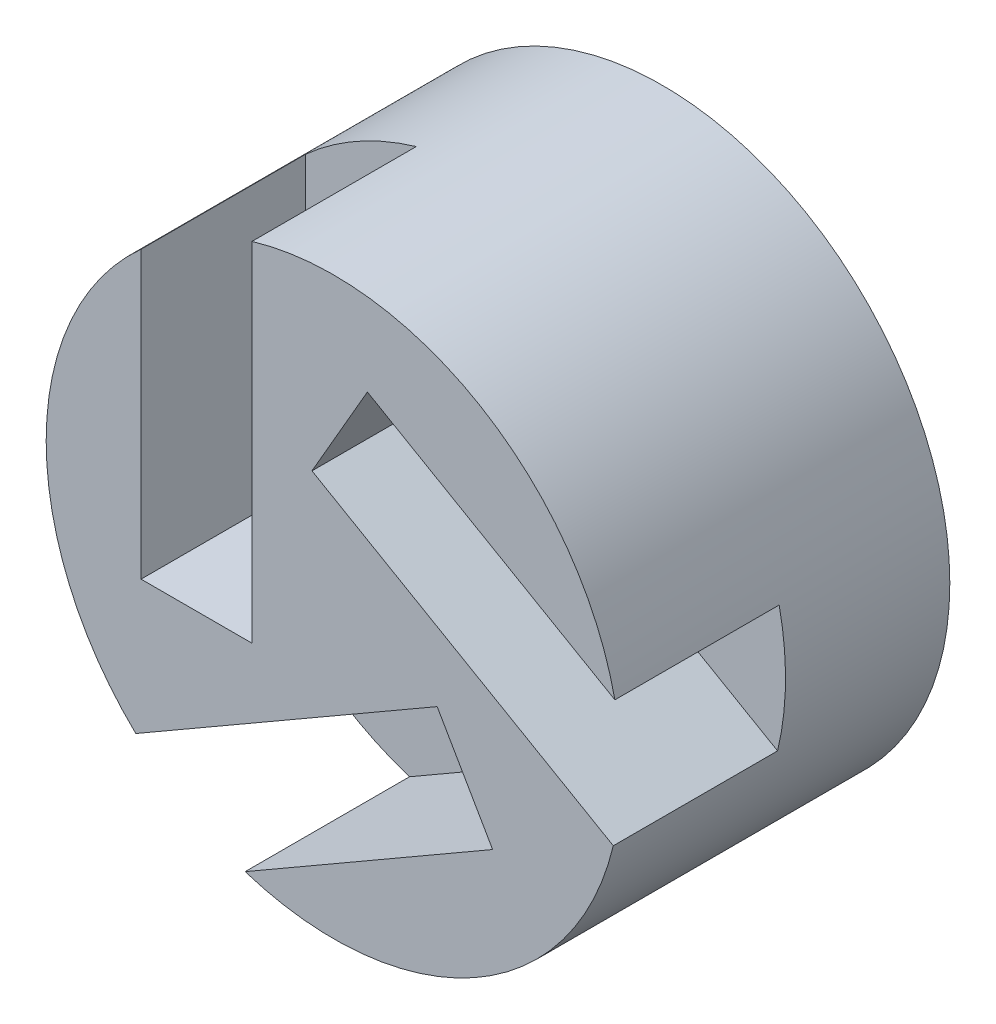
ISO-10303-21;
HEADER;
FILE_DESCRIPTION(('STEP AP214'),'2;1');
FILE_NAME('part.step','',(''),(''),'','','');
FILE_SCHEMA(('AUTOMOTIVE_DESIGN { 1 0 10303 214 1 1 1 1 }'));
ENDSEC;
DATA;
#1=APPLICATION_CONTEXT('core data for automotive mechanical design processes');
#2=APPLICATION_PROTOCOL_DEFINITION('international standard','automotive_design',2000,#1);
#3=PRODUCT_CONTEXT('',#1,'mechanical');
#4=PRODUCT('Part','Part','',(#3));
#5=PRODUCT_RELATED_PRODUCT_CATEGORY('part','',(#4));
#6=PRODUCT_DEFINITION_FORMATION('','',#4);
#7=PRODUCT_DEFINITION_CONTEXT('part definition',#1,'design');
#8=PRODUCT_DEFINITION('design','',#6,#7);
#9=PRODUCT_DEFINITION_SHAPE('','',#8);
#10=(LENGTH_UNIT() NAMED_UNIT(*) SI_UNIT(.MILLI.,.METRE.));
#11=(NAMED_UNIT(*) PLANE_ANGLE_UNIT() SI_UNIT($,.RADIAN.));
#12=(NAMED_UNIT(*) SI_UNIT($,.STERADIAN.) SOLID_ANGLE_UNIT());
#13=UNCERTAINTY_MEASURE_WITH_UNIT(LENGTH_MEASURE(1.E-05),#10,'distance_accuracy_value','');
#14=(GEOMETRIC_REPRESENTATION_CONTEXT(3) GLOBAL_UNCERTAINTY_ASSIGNED_CONTEXT((#13)) GLOBAL_UNIT_ASSIGNED_CONTEXT((#10,
#11,#12)) REPRESENTATION_CONTEXT('',''));
#15=CARTESIAN_POINT('',(0.,0.,0.));
#16=DIRECTION('',(0.,0.,1.));
#17=DIRECTION('',(1.,0.,0.));
#18=AXIS2_PLACEMENT_3D('',#15,#16,#17);
#19=CARTESIAN_POINT('',(0.,0.,0.));
#20=DIRECTION('',(0.,0.,-1.));
#21=DIRECTION('',(-1.,0.,0.));
#22=AXIS2_PLACEMENT_3D('',#19,#20,#21);
#23=PLANE('',#22);
#24=CARTESIAN_POINT('',(7.46538653438088,5.33042877568823,0.));
#25=DIRECTION('',(0.,0.,1.));
#26=DIRECTION('',(1.,0.,0.));
#27=AXIS2_PLACEMENT_3D('',#24,#25,#26);
#28=CIRCLE('',#27,1.625);
#29=CARTESIAN_POINT('',(9.09038653438088,5.33042877568823,0.));
#30=VERTEX_POINT('',#29);
#31=EDGE_CURVE('E300',#30,#30,#28,.T.);
#32=ORIENTED_EDGE('',*,*,#31,.F.);
#33=EDGE_LOOP('',(#32));
#34=FACE_BOUND('',#33,.T.);
#35=DIRECTION('',(-0.866025403784439,0.5,0.));
#36=VECTOR('',#35,1.);
#37=CARTESIAN_POINT('',(5.86199000000002,10.1532645134607,0.));
#38=LINE('',#37,#36);
#39=CARTESIAN_POINT('',(17.1135996501656,3.65714465312103,0.));
#40=VERTEX_POINT('',#39);
#41=CARTESIAN_POINT('',(2.05147822334851,12.3532645134607,0.));
#42=VERTEX_POINT('',#41);
#43=EDGE_CURVE('E166',#40,#42,#38,.T.);
#44=ORIENTED_EDGE('',*,*,#43,.T.);
#45=DIRECTION('',(-0.5,-0.866025403784439,0.));
#46=VECTOR('',#45,1.);
#47=CARTESIAN_POINT('',(-3.81051177665152,2.19999999999999,0.));
#48=LINE('',#47,#46);
#49=CARTESIAN_POINT('',(-1.32352177665146,6.50759303791581,0.));
#50=VERTEX_POINT('',#49);
#51=EDGE_CURVE('E175',#42,#50,#48,.T.);
#52=ORIENTED_EDGE('',*,*,#51,.T.);
#53=DIRECTION('',(0.866025403784439,-0.5,0.));
#54=VECTOR('',#53,1.);
#55=CARTESIAN_POINT('',(2.48699000000006,4.30759303791582,0.));
#56=LINE('',#55,#54);
#57=CARTESIAN_POINT('',(17.0173768571935,-4.0815297255142,0.));
#58=VERTEX_POINT('',#57);
#59=EDGE_CURVE('E350',#50,#58,#56,.T.);
#60=ORIENTED_EDGE('',*,*,#59,.T.);
#61=CARTESIAN_POINT('',(0.,0.,0.));
#62=DIRECTION('',(0.,0.,-1.));
#63=DIRECTION('',(-1.,0.,0.));
#64=AXIS2_PLACEMENT_3D('',#61,#62,#63);
#65=CIRCLE('',#64,17.5);
#66=EDGE_CURVE('E281',#40,#58,#65,.T.);
#67=ORIENTED_EDGE('',*,*,#66,.F.);
#68=EDGE_LOOP('',(#44,#52,#60,#67));
#69=FACE_BOUND('',#68,.T.);
#70=ADVANCED_FACE('F149',(#34,#69),#23,.F.);
#71=CARTESIAN_POINT('',(0.,0.,10.));
#72=DIRECTION('',(0.,0.,-1.));
#73=DIRECTION('',(-1.,0.,0.));
#74=AXIS2_PLACEMENT_3D('',#71,#72,#73);
#75=CYLINDRICAL_SURFACE('',#74,17.5);
#76=CARTESIAN_POINT('',(0.,0.,10.));
#77=DIRECTION('',(0.,0.,1.));
#78=DIRECTION('',(1.,0.,0.));
#79=AXIS2_PLACEMENT_3D('',#76,#77,#78);
#80=CIRCLE('',#79,17.5);
#81=CARTESIAN_POINT('',(-5.38961965016557,-16.6493843738004,10.));
#82=VERTEX_POINT('',#81);
#83=CARTESIAN_POINT('',(17.0173768571935,-4.0815297255142,10.));
#84=VERTEX_POINT('',#83);
#85=EDGE_CURVE('E12',#82,#84,#80,.T.);
#86=ORIENTED_EDGE('',*,*,#85,.F.);
#87=DIRECTION('',(0.,0.,1.));
#88=VECTOR('',#87,1.);
#89=CARTESIAN_POINT('',(-5.38961965016557,-16.6493843738004,0.));
#90=LINE('',#89,#88);
#91=CARTESIAN_POINT('',(-5.38961965016557,-16.6493843738004,0.));
#92=VERTEX_POINT('',#91);
#93=EDGE_CURVE('E362',#92,#82,#90,.T.);
#94=ORIENTED_EDGE('',*,*,#93,.F.);
#95=CARTESIAN_POINT('',(-12.0433968571934,-12.6967158013458,0.));
#96=VERTEX_POINT('',#95);
#97=EDGE_CURVE('E282',#92,#96,#65,.T.);
#98=ORIENTED_EDGE('',*,*,#97,.T.);
#99=DIRECTION('',(0.,0.,1.));
#100=VECTOR('',#99,1.);
#101=CARTESIAN_POINT('',(-12.0433968571934,-12.6967158013458,0.));
#102=LINE('',#101,#100);
#103=CARTESIAN_POINT('',(-12.0433968571934,-12.6967158013458,10.));
#104=VERTEX_POINT('',#103);
#105=EDGE_CURVE('E373',#96,#104,#102,.T.);
#106=ORIENTED_EDGE('',*,*,#105,.T.);
#107=CARTESIAN_POINT('',(-11.72398,12.9922397206794,10.));
#108=VERTEX_POINT('',#107);
#109=EDGE_CURVE('E159',#108,#104,#80,.T.);
#110=ORIENTED_EDGE('',*,*,#109,.F.);
#111=DIRECTION('',(0.,0.,1.));
#112=VECTOR('',#111,1.);
#113=CARTESIAN_POINT('',(-11.72398,12.9922397206794,0.));
#114=LINE('',#113,#112);
#115=CARTESIAN_POINT('',(-11.72398,12.9922397206794,0.));
#116=VERTEX_POINT('',#115);
#117=EDGE_CURVE('E277',#116,#108,#114,.T.);
#118=ORIENTED_EDGE('',*,*,#117,.F.);
#119=CARTESIAN_POINT('',(-4.97397999999998,16.7782455268601,0.));
#120=VERTEX_POINT('',#119);
#121=EDGE_CURVE('E269',#116,#120,#65,.T.);
#122=ORIENTED_EDGE('',*,*,#121,.T.);
#123=DIRECTION('',(0.,0.,1.));
#124=VECTOR('',#123,1.);
#125=CARTESIAN_POINT('',(-4.97397999999998,16.7782455268601,0.));
#126=LINE('',#125,#124);
#127=CARTESIAN_POINT('',(-4.97397999999998,16.7782455268601,10.));
#128=VERTEX_POINT('',#127);
#129=EDGE_CURVE('E252',#120,#128,#126,.T.);
#130=ORIENTED_EDGE('',*,*,#129,.T.);
#131=CARTESIAN_POINT('',(17.1135996501656,3.65714465312103,10.));
#132=VERTEX_POINT('',#131);
#133=EDGE_CURVE('E153',#132,#128,#80,.T.);
#134=ORIENTED_EDGE('',*,*,#133,.F.);
#135=DIRECTION('',(0.,0.,1.));
#136=VECTOR('',#135,1.);
#137=CARTESIAN_POINT('',(17.1135996501656,3.65714465312103,0.));
#138=LINE('',#137,#136);
#139=EDGE_CURVE('E311',#40,#132,#138,.T.);
#140=ORIENTED_EDGE('',*,*,#139,.F.);
#141=ORIENTED_EDGE('',*,*,#66,.T.);
#142=DIRECTION('',(0.,0.,1.));
#143=VECTOR('',#142,1.);
#144=CARTESIAN_POINT('',(17.0173768571935,-4.0815297255142,0.));
#145=LINE('',#144,#143);
#146=EDGE_CURVE('E199',#58,#84,#145,.T.);
#147=ORIENTED_EDGE('',*,*,#146,.T.);
#148=EDGE_LOOP('',(#86,#94,#98,#106,#110,#118,#122,#130,#134,#140,#141,#147));
#149=FACE_BOUND('',#148,.T.);
#150=CARTESIAN_POINT('',(0.,0.,-10.));
#151=DIRECTION('',(0.,0.,-1.));
#152=DIRECTION('',(-1.,0.,0.));
#153=AXIS2_PLACEMENT_3D('',#150,#151,#152);
#154=CIRCLE('',#153,17.5);
#155=CARTESIAN_POINT('',(-17.5,0.,-10.));
#156=VERTEX_POINT('',#155);
#157=EDGE_CURVE('E280',#156,#156,#154,.T.);
#158=ORIENTED_EDGE('',*,*,#157,.F.);
#159=EDGE_LOOP('',(#158));
#160=FACE_BOUND('',#159,.T.);
#161=ADVANCED_FACE('F151',(#149,#160),#75,.T.);
#162=CARTESIAN_POINT('',(0.,0.,10.));
#163=DIRECTION('',(0.,0.,1.));
#164=DIRECTION('',(1.,0.,0.));
#165=AXIS2_PLACEMENT_3D('',#162,#163,#164);
#166=PLANE('',#165);
#167=ORIENTED_EDGE('',*,*,#133,.T.);
#168=DIRECTION('',(0.,-1.,0.));
#169=VECTOR('',#168,1.);
#170=CARTESIAN_POINT('',(-4.97397999999998,0.,10.));
#171=LINE('',#170,#169);
#172=CARTESIAN_POINT('',(-4.97397999999998,-4.40000000000002,10.));
#173=VERTEX_POINT('',#172);
#174=EDGE_CURVE('E258',#128,#173,#171,.T.);
#175=ORIENTED_EDGE('',*,*,#174,.T.);
#176=DIRECTION('',(-1.,0.,0.));
#177=VECTOR('',#176,1.);
#178=CARTESIAN_POINT('',(0.,-4.40000000000002,10.));
#179=LINE('',#178,#177);
#180=CARTESIAN_POINT('',(-11.72398,-4.40000000000002,10.));
#181=VERTEX_POINT('',#180);
#182=EDGE_CURVE('E414',#173,#181,#179,.T.);
#183=ORIENTED_EDGE('',*,*,#182,.T.);
#184=DIRECTION('',(0.,1.,0.));
#185=VECTOR('',#184,1.);
#186=CARTESIAN_POINT('',(-11.72398,0.,10.));
#187=LINE('',#186,#185);
#188=EDGE_CURVE('E273',#181,#108,#187,.T.);
#189=ORIENTED_EDGE('',*,*,#188,.T.);
#190=ORIENTED_EDGE('',*,*,#109,.T.);
#191=DIRECTION('',(0.866025403784439,0.5,0.));
#192=VECTOR('',#191,1.);
#193=CARTESIAN_POINT('',(2.48699000000002,-4.30759303791575,10.));
#194=LINE('',#193,#192);
#195=CARTESIAN_POINT('',(6.29750177665157,-2.10759303791574,10.));
#196=VERTEX_POINT('',#195);
#197=EDGE_CURVE('E394',#104,#196,#194,.T.);
#198=ORIENTED_EDGE('',*,*,#197,.T.);
#199=DIRECTION('',(0.5,-0.866025403784439,0.));
#200=VECTOR('',#199,1.);
#201=CARTESIAN_POINT('',(3.81051177665155,2.20000000000001,10.));
#202=LINE('',#201,#200);
#203=CARTESIAN_POINT('',(9.67250177665157,-7.9532645134607,10.));
#204=VERTEX_POINT('',#203);
#205=EDGE_CURVE('E391',#196,#204,#202,.T.);
#206=ORIENTED_EDGE('',*,*,#205,.T.);
#207=DIRECTION('',(-0.866025403784439,-0.5,0.));
#208=VECTOR('',#207,1.);
#209=CARTESIAN_POINT('',(5.86199000000001,-10.1532645134607,10.));
#210=LINE('',#209,#208);
#211=EDGE_CURVE('E386',#204,#82,#210,.T.);
#212=ORIENTED_EDGE('',*,*,#211,.T.);
#213=ORIENTED_EDGE('',*,*,#85,.T.);
#214=DIRECTION('',(0.866025403784439,-0.5,0.));
#215=VECTOR('',#214,1.);
#216=CARTESIAN_POINT('',(2.48699000000006,4.30759303791582,10.));
#217=LINE('',#216,#215);
#218=CARTESIAN_POINT('',(-1.32352177665146,6.50759303791581,10.));
#219=VERTEX_POINT('',#218);
#220=EDGE_CURVE('E361',#219,#84,#217,.T.);
#221=ORIENTED_EDGE('',*,*,#220,.F.);
#222=DIRECTION('',(-0.5,-0.866025403784439,0.));
#223=VECTOR('',#222,1.);
#224=CARTESIAN_POINT('',(-3.81051177665152,2.19999999999999,10.));
#225=LINE('',#224,#223);
#226=CARTESIAN_POINT('',(2.05147822334851,12.3532645134607,10.));
#227=VERTEX_POINT('',#226);
#228=EDGE_CURVE('E193',#227,#219,#225,.T.);
#229=ORIENTED_EDGE('',*,*,#228,.F.);
#230=DIRECTION('',(-0.866025403784439,0.5,0.));
#231=VECTOR('',#230,1.);
#232=CARTESIAN_POINT('',(5.86199000000002,10.1532645134607,10.));
#233=LINE('',#232,#231);
#234=EDGE_CURVE('E359',#132,#227,#233,.T.);
#235=ORIENTED_EDGE('',*,*,#234,.F.);
#236=EDGE_LOOP('',(#167,#175,#183,#189,#190,#198,#206,#212,#213,#221,#229,#235));
#237=FACE_BOUND('',#236,.T.);
#238=ADVANCED_FACE('F427',(#237),#166,.T.);
#239=CARTESIAN_POINT('',(0.883593465619149,-9.1304287756882,0.));
#240=DIRECTION('',(0.,0.,1.));
#241=DIRECTION('',(1.,0.,0.));
#242=AXIS2_PLACEMENT_3D('',#239,#240,#241);
#243=CIRCLE('',#242,1.62500000000001);
#244=CARTESIAN_POINT('',(2.50859346561916,-9.1304287756882,0.));
#245=VERTEX_POINT('',#244);
#246=EDGE_CURVE('E325',#245,#245,#243,.T.);
#247=ORIENTED_EDGE('',*,*,#246,.F.);
#248=EDGE_LOOP('',(#247));
#249=FACE_BOUND('',#248,.T.);
#250=ORIENTED_EDGE('',*,*,#97,.F.);
#251=DIRECTION('',(-0.866025403784439,-0.5,0.));
#252=VECTOR('',#251,1.);
#253=CARTESIAN_POINT('',(5.86199000000001,-10.1532645134607,0.));
#254=LINE('',#253,#252);
#255=CARTESIAN_POINT('',(9.67250177665157,-7.9532645134607,0.));
#256=VERTEX_POINT('',#255);
#257=EDGE_CURVE('E377',#256,#92,#254,.T.);
#258=ORIENTED_EDGE('',*,*,#257,.F.);
#259=DIRECTION('',(0.5,-0.866025403784439,0.));
#260=VECTOR('',#259,1.);
#261=CARTESIAN_POINT('',(3.81051177665155,2.20000000000001,0.));
#262=LINE('',#261,#260);
#263=CARTESIAN_POINT('',(6.29750177665157,-2.10759303791574,0.));
#264=VERTEX_POINT('',#263);
#265=EDGE_CURVE('E401',#264,#256,#262,.T.);
#266=ORIENTED_EDGE('',*,*,#265,.F.);
#267=DIRECTION('',(0.866025403784439,0.5,0.));
#268=VECTOR('',#267,1.);
#269=CARTESIAN_POINT('',(2.48699000000002,-4.30759303791575,0.));
#270=LINE('',#269,#268);
#271=EDGE_CURVE('E390',#96,#264,#270,.T.);
#272=ORIENTED_EDGE('',*,*,#271,.F.);
#273=EDGE_LOOP('',(#250,#258,#266,#272));
#274=FACE_BOUND('',#273,.T.);
#275=ADVANCED_FACE('F443',(#249,#274),#23,.F.);
#276=CARTESIAN_POINT('',(0.,0.,-10.));
#277=DIRECTION('',(0.,0.,-1.));
#278=DIRECTION('',(-1.,0.,0.));
#279=AXIS2_PLACEMENT_3D('',#276,#277,#278);
#280=PLANE('',#279);
#281=CARTESIAN_POINT('',(7.46538653438088,5.33042877568823,-10.));
#282=DIRECTION('',(0.,0.,1.));
#283=DIRECTION('',(1.,0.,0.));
#284=AXIS2_PLACEMENT_3D('',#281,#282,#283);
#285=CIRCLE('',#284,1.625);
#286=CARTESIAN_POINT('',(9.09038653438088,5.33042877568823,-10.));
#287=VERTEX_POINT('',#286);
#288=EDGE_CURVE('E293',#287,#287,#285,.T.);
#289=ORIENTED_EDGE('',*,*,#288,.T.);
#290=EDGE_LOOP('',(#289));
#291=FACE_BOUND('',#290,.T.);
#292=CARTESIAN_POINT('',(-8.34897999999998,3.79999999999998,-10.));
#293=DIRECTION('',(0.,0.,1.));
#294=DIRECTION('',(1.,0.,0.));
#295=AXIS2_PLACEMENT_3D('',#292,#293,#294);
#296=CIRCLE('',#295,1.625);
#297=CARTESIAN_POINT('',(-6.72397999999998,3.79999999999998,-10.));
#298=VERTEX_POINT('',#297);
#299=EDGE_CURVE('E308',#298,#298,#296,.T.);
#300=ORIENTED_EDGE('',*,*,#299,.T.);
#301=EDGE_LOOP('',(#300));
#302=FACE_BOUND('',#301,.T.);
#303=CARTESIAN_POINT('',(0.883593465619149,-9.1304287756882,-10.));
#304=DIRECTION('',(0.,0.,1.));
#305=DIRECTION('',(1.,0.,0.));
#306=AXIS2_PLACEMENT_3D('',#303,#304,#305);
#307=CIRCLE('',#306,1.62500000000001);
#308=CARTESIAN_POINT('',(2.50859346561916,-9.1304287756882,-10.));
#309=VERTEX_POINT('',#308);
#310=EDGE_CURVE('E321',#309,#309,#307,.T.);
#311=ORIENTED_EDGE('',*,*,#310,.T.);
#312=EDGE_LOOP('',(#311));
#313=FACE_BOUND('',#312,.T.);
#314=ORIENTED_EDGE('',*,*,#157,.T.);
#315=EDGE_LOOP('',(#314));
#316=FACE_BOUND('',#315,.T.);
#317=ADVANCED_FACE('F445',(#291,#302,#313,#316),#280,.T.);
#318=CARTESIAN_POINT('',(-8.34897999999998,3.79999999999998,0.));
#319=DIRECTION('',(0.,0.,1.));
#320=DIRECTION('',(1.,0.,0.));
#321=AXIS2_PLACEMENT_3D('',#318,#319,#320);
#322=CIRCLE('',#321,1.625);
#323=CARTESIAN_POINT('',(-6.72397999999998,3.79999999999998,0.));
#324=VERTEX_POINT('',#323);
#325=EDGE_CURVE('E317',#324,#324,#322,.T.);
#326=ORIENTED_EDGE('',*,*,#325,.F.);
#327=EDGE_LOOP('',(#326));
#328=FACE_BOUND('',#327,.T.);
#329=ORIENTED_EDGE('',*,*,#121,.F.);
#330=DIRECTION('',(0.,1.,0.));
#331=VECTOR('',#330,1.);
#332=CARTESIAN_POINT('',(-11.72398,0.,0.));
#333=LINE('',#332,#331);
#334=CARTESIAN_POINT('',(-11.72398,-4.40000000000002,0.));
#335=VERTEX_POINT('',#334);
#336=EDGE_CURVE('E263',#335,#116,#333,.T.);
#337=ORIENTED_EDGE('',*,*,#336,.F.);
#338=DIRECTION('',(-1.,0.,0.));
#339=VECTOR('',#338,1.);
#340=CARTESIAN_POINT('',(0.,-4.40000000000002,0.));
#341=LINE('',#340,#339);
#342=CARTESIAN_POINT('',(-4.97397999999998,-4.40000000000002,0.));
#343=VERTEX_POINT('',#342);
#344=EDGE_CURVE('E271',#343,#335,#341,.T.);
#345=ORIENTED_EDGE('',*,*,#344,.F.);
#346=DIRECTION('',(0.,-1.,0.));
#347=VECTOR('',#346,1.);
#348=CARTESIAN_POINT('',(-4.97397999999998,0.,0.));
#349=LINE('',#348,#347);
#350=EDGE_CURVE('E255',#120,#343,#349,.T.);
#351=ORIENTED_EDGE('',*,*,#350,.F.);
#352=EDGE_LOOP('',(#329,#337,#345,#351));
#353=FACE_BOUND('',#352,.T.);
#354=ADVANCED_FACE('F267',(#328,#353),#23,.F.);
#355=CARTESIAN_POINT('',(-8.34897999999998,3.79999999999998,-10.));
#356=DIRECTION('',(0.,0.,1.));
#357=DIRECTION('',(1.,0.,0.));
#358=AXIS2_PLACEMENT_3D('',#355,#356,#357);
#359=CYLINDRICAL_SURFACE('',#358,1.625);
#360=ORIENTED_EDGE('',*,*,#299,.F.);
#361=EDGE_LOOP('',(#360));
#362=FACE_BOUND('',#361,.T.);
#363=ORIENTED_EDGE('',*,*,#325,.T.);
#364=EDGE_LOOP('',(#363));
#365=FACE_BOUND('',#364,.T.);
#366=ADVANCED_FACE('F453',(#362,#365),#359,.F.);
#367=CARTESIAN_POINT('',(0.883593465619149,-9.1304287756882,-10.));
#368=DIRECTION('',(0.,0.,1.));
#369=DIRECTION('',(1.,0.,0.));
#370=AXIS2_PLACEMENT_3D('',#367,#368,#369);
#371=CYLINDRICAL_SURFACE('',#370,1.62500000000001);
#372=ORIENTED_EDGE('',*,*,#310,.F.);
#373=EDGE_LOOP('',(#372));
#374=FACE_BOUND('',#373,.T.);
#375=ORIENTED_EDGE('',*,*,#246,.T.);
#376=EDGE_LOOP('',(#375));
#377=FACE_BOUND('',#376,.T.);
#378=ADVANCED_FACE('F464',(#374,#377),#371,.F.);
#379=CARTESIAN_POINT('',(7.46538653438088,5.33042877568823,-10.));
#380=DIRECTION('',(0.,0.,1.));
#381=DIRECTION('',(1.,0.,0.));
#382=AXIS2_PLACEMENT_3D('',#379,#380,#381);
#383=CYLINDRICAL_SURFACE('',#382,1.625);
#384=ORIENTED_EDGE('',*,*,#288,.F.);
#385=EDGE_LOOP('',(#384));
#386=FACE_BOUND('',#385,.T.);
#387=ORIENTED_EDGE('',*,*,#31,.T.);
#388=EDGE_LOOP('',(#387));
#389=FACE_BOUND('',#388,.T.);
#390=ADVANCED_FACE('F461',(#386,#389),#383,.F.);
#391=CARTESIAN_POINT('',(5.86199000000002,10.1532645134607,0.));
#392=DIRECTION('',(0.5,0.866025403784439,0.));
#393=DIRECTION('',(-0.866025403784439,0.5,0.));
#394=AXIS2_PLACEMENT_3D('',#391,#392,#393);
#395=PLANE('',#394);
#396=ORIENTED_EDGE('',*,*,#234,.T.);
#397=DIRECTION('',(0.,0.,1.));
#398=VECTOR('',#397,1.);
#399=CARTESIAN_POINT('',(2.05147822334851,12.3532645134607,0.));
#400=LINE('',#399,#398);
#401=EDGE_CURVE('E328',#42,#227,#400,.T.);
#402=ORIENTED_EDGE('',*,*,#401,.F.);
#403=ORIENTED_EDGE('',*,*,#43,.F.);
#404=ORIENTED_EDGE('',*,*,#139,.T.);
#405=EDGE_LOOP('',(#396,#402,#403,#404));
#406=FACE_BOUND('',#405,.T.);
#407=ADVANCED_FACE('F463',(#406),#395,.F.);
#408=CARTESIAN_POINT('',(-3.81051177665152,2.19999999999999,0.));
#409=DIRECTION('',(-0.866025403784439,0.5,0.));
#410=DIRECTION('',(-0.5,-0.866025403784439,0.));
#411=AXIS2_PLACEMENT_3D('',#408,#409,#410);
#412=PLANE('',#411);
#413=ORIENTED_EDGE('',*,*,#228,.T.);
#414=DIRECTION('',(0.,0.,1.));
#415=VECTOR('',#414,1.);
#416=CARTESIAN_POINT('',(-1.32352177665146,6.50759303791581,0.));
#417=LINE('',#416,#415);
#418=EDGE_CURVE('E334',#50,#219,#417,.T.);
#419=ORIENTED_EDGE('',*,*,#418,.F.);
#420=ORIENTED_EDGE('',*,*,#51,.F.);
#421=ORIENTED_EDGE('',*,*,#401,.T.);
#422=EDGE_LOOP('',(#413,#419,#420,#421));
#423=FACE_BOUND('',#422,.T.);
#424=ADVANCED_FACE('F470',(#423),#412,.F.);
#425=CARTESIAN_POINT('',(2.48699000000006,4.30759303791582,0.));
#426=DIRECTION('',(-0.5,-0.866025403784439,0.));
#427=DIRECTION('',(0.866025403784439,-0.5,0.));
#428=AXIS2_PLACEMENT_3D('',#425,#426,#427);
#429=PLANE('',#428);
#430=ORIENTED_EDGE('',*,*,#220,.T.);
#431=ORIENTED_EDGE('',*,*,#146,.F.);
#432=ORIENTED_EDGE('',*,*,#59,.F.);
#433=ORIENTED_EDGE('',*,*,#418,.T.);
#434=EDGE_LOOP('',(#430,#431,#432,#433));
#435=FACE_BOUND('',#434,.T.);
#436=ADVANCED_FACE('F542',(#435),#429,.F.);
#437=CARTESIAN_POINT('',(5.86199000000001,-10.1532645134607,0.));
#438=DIRECTION('',(-0.5,0.866025403784439,0.));
#439=DIRECTION('',(-0.866025403784439,-0.5,0.));
#440=AXIS2_PLACEMENT_3D('',#437,#438,#439);
#441=PLANE('',#440);
#442=ORIENTED_EDGE('',*,*,#211,.F.);
#443=DIRECTION('',(0.,0.,1.));
#444=VECTOR('',#443,1.);
#445=CARTESIAN_POINT('',(9.67250177665157,-7.9532645134607,0.));
#446=LINE('',#445,#444);
#447=EDGE_CURVE('E380',#256,#204,#446,.T.);
#448=ORIENTED_EDGE('',*,*,#447,.F.);
#449=ORIENTED_EDGE('',*,*,#257,.T.);
#450=ORIENTED_EDGE('',*,*,#93,.T.);
#451=EDGE_LOOP('',(#442,#448,#449,#450));
#452=FACE_BOUND('',#451,.T.);
#453=ADVANCED_FACE('F440',(#452),#441,.T.);
#454=CARTESIAN_POINT('',(3.81051177665155,2.20000000000001,0.));
#455=DIRECTION('',(-0.866025403784439,-0.5,0.));
#456=DIRECTION('',(0.5,-0.866025403784439,0.));
#457=AXIS2_PLACEMENT_3D('',#454,#455,#456);
#458=PLANE('',#457);
#459=ORIENTED_EDGE('',*,*,#205,.F.);
#460=DIRECTION('',(0.,0.,1.));
#461=VECTOR('',#460,1.);
#462=CARTESIAN_POINT('',(6.29750177665157,-2.10759303791574,0.));
#463=LINE('',#462,#461);
#464=EDGE_CURVE('E376',#264,#196,#463,.T.);
#465=ORIENTED_EDGE('',*,*,#464,.F.);
#466=ORIENTED_EDGE('',*,*,#265,.T.);
#467=ORIENTED_EDGE('',*,*,#447,.T.);
#468=EDGE_LOOP('',(#459,#465,#466,#467));
#469=FACE_BOUND('',#468,.T.);
#470=ADVANCED_FACE('F437',(#469),#458,.T.);
#471=CARTESIAN_POINT('',(2.48699000000002,-4.30759303791575,0.));
#472=DIRECTION('',(0.5,-0.866025403784439,0.));
#473=DIRECTION('',(0.866025403784439,0.5,0.));
#474=AXIS2_PLACEMENT_3D('',#471,#472,#473);
#475=PLANE('',#474);
#476=ORIENTED_EDGE('',*,*,#197,.F.);
#477=ORIENTED_EDGE('',*,*,#105,.F.);
#478=ORIENTED_EDGE('',*,*,#271,.T.);
#479=ORIENTED_EDGE('',*,*,#464,.T.);
#480=EDGE_LOOP('',(#476,#477,#478,#479));
#481=FACE_BOUND('',#480,.T.);
#482=ADVANCED_FACE('F433',(#481),#475,.T.);
#483=CARTESIAN_POINT('',(-11.72398,0.,0.));
#484=DIRECTION('',(1.,0.,0.));
#485=DIRECTION('',(0.,0.,-1.));
#486=AXIS2_PLACEMENT_3D('',#483,#484,#485);
#487=PLANE('',#486);
#488=ORIENTED_EDGE('',*,*,#188,.F.);
#489=DIRECTION('',(0.,0.,1.));
#490=VECTOR('',#489,1.);
#491=CARTESIAN_POINT('',(-11.72398,-4.40000000000002,0.));
#492=LINE('',#491,#490);
#493=EDGE_CURVE('E408',#335,#181,#492,.T.);
#494=ORIENTED_EDGE('',*,*,#493,.F.);
#495=ORIENTED_EDGE('',*,*,#336,.T.);
#496=ORIENTED_EDGE('',*,*,#117,.T.);
#497=EDGE_LOOP('',(#488,#494,#495,#496));
#498=FACE_BOUND('',#497,.T.);
#499=ADVANCED_FACE('F426',(#498),#487,.T.);
#500=CARTESIAN_POINT('',(0.,-4.40000000000002,0.));
#501=DIRECTION('',(0.,1.,0.));
#502=DIRECTION('',(-1.,0.,0.));
#503=AXIS2_PLACEMENT_3D('',#500,#501,#502);
#504=PLANE('',#503);
#505=ORIENTED_EDGE('',*,*,#182,.F.);
#506=DIRECTION('',(0.,0.,1.));
#507=VECTOR('',#506,1.);
#508=CARTESIAN_POINT('',(-4.97397999999998,-4.40000000000002,0.));
#509=LINE('',#508,#507);
#510=EDGE_CURVE('E262',#343,#173,#509,.T.);
#511=ORIENTED_EDGE('',*,*,#510,.F.);
#512=ORIENTED_EDGE('',*,*,#344,.T.);
#513=ORIENTED_EDGE('',*,*,#493,.T.);
#514=EDGE_LOOP('',(#505,#511,#512,#513));
#515=FACE_BOUND('',#514,.T.);
#516=ADVANCED_FACE('F423',(#515),#504,.T.);
#517=CARTESIAN_POINT('',(-4.97397999999998,0.,0.));
#518=DIRECTION('',(-1.,0.,0.));
#519=DIRECTION('',(0.,-1.,0.));
#520=AXIS2_PLACEMENT_3D('',#517,#518,#519);
#521=PLANE('',#520);
#522=ORIENTED_EDGE('',*,*,#174,.F.);
#523=ORIENTED_EDGE('',*,*,#129,.F.);
#524=ORIENTED_EDGE('',*,*,#350,.T.);
#525=ORIENTED_EDGE('',*,*,#510,.T.);
#526=EDGE_LOOP('',(#522,#523,#524,#525));
#527=FACE_BOUND('',#526,.T.);
#528=ADVANCED_FACE('F254',(#527),#521,.T.);
#529=CLOSED_SHELL('',(#70,#161,#238,#275,#317,#354,#366,#378,#390,#407,#424,#436,#453,#470,#482,
#499,#516,#528));
#530=MANIFOLD_SOLID_BREP('B2',#529);
#531=ADVANCED_BREP_SHAPE_REPRESENTATION('',(#18,#530),#14);
#532=SHAPE_DEFINITION_REPRESENTATION(#9,#531);
ENDSEC;
END-ISO-10303-21;
